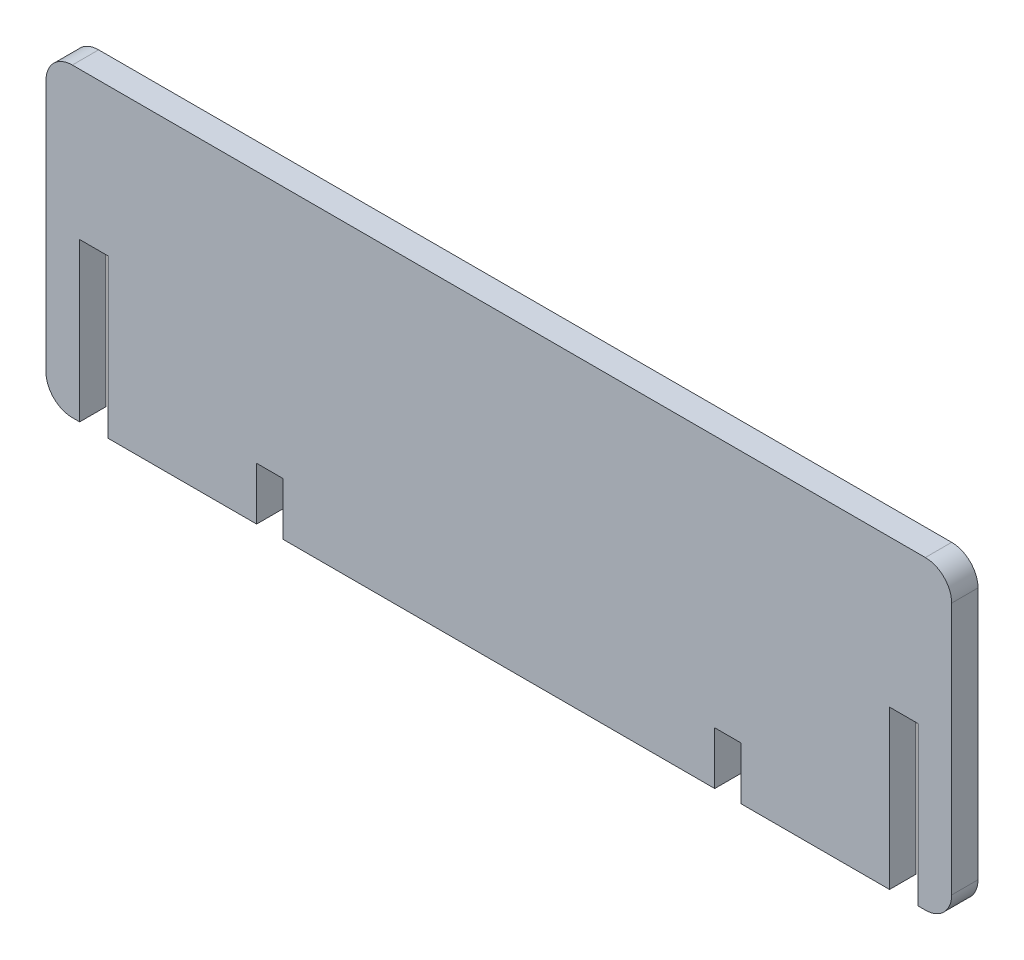
ISO-10303-21;
HEADER;
FILE_DESCRIPTION(('STEP AP214'),'2;1');
FILE_NAME('part.step','',(''),(''),'','','');
FILE_SCHEMA(('AUTOMOTIVE_DESIGN { 1 0 10303 214 1 1 1 1 }'));
ENDSEC;
DATA;
#1=APPLICATION_CONTEXT('core data for automotive mechanical design processes');
#2=APPLICATION_PROTOCOL_DEFINITION('international standard','automotive_design',2000,#1);
#3=PRODUCT_CONTEXT('',#1,'mechanical');
#4=PRODUCT('Part','Part','',(#3));
#5=PRODUCT_RELATED_PRODUCT_CATEGORY('part','',(#4));
#6=PRODUCT_DEFINITION_FORMATION('','',#4);
#7=PRODUCT_DEFINITION_CONTEXT('part definition',#1,'design');
#8=PRODUCT_DEFINITION('design','',#6,#7);
#9=PRODUCT_DEFINITION_SHAPE('','',#8);
#10=(LENGTH_UNIT() NAMED_UNIT(*) SI_UNIT(.MILLI.,.METRE.));
#11=(NAMED_UNIT(*) PLANE_ANGLE_UNIT() SI_UNIT($,.RADIAN.));
#12=(NAMED_UNIT(*) SI_UNIT($,.STERADIAN.) SOLID_ANGLE_UNIT());
#13=UNCERTAINTY_MEASURE_WITH_UNIT(LENGTH_MEASURE(1.E-05),#10,'distance_accuracy_value','');
#14=(GEOMETRIC_REPRESENTATION_CONTEXT(3) GLOBAL_UNCERTAINTY_ASSIGNED_CONTEXT((#13)) GLOBAL_UNIT_ASSIGNED_CONTEXT((#10,
#11,#12)) REPRESENTATION_CONTEXT('',''));
#15=CARTESIAN_POINT('',(0.,0.,0.));
#16=DIRECTION('',(0.,0.,1.));
#17=DIRECTION('',(1.,0.,0.));
#18=AXIS2_PLACEMENT_3D('',#15,#16,#17);
#19=CARTESIAN_POINT('',(-30.1312319017657,0.,2.5));
#20=DIRECTION('',(1.,0.,0.));
#21=DIRECTION('',(0.,1.,0.));
#22=AXIS2_PLACEMENT_3D('',#19,#20,#21);
#23=PLANE('',#22);
#24=DIRECTION('',(0.,-1.,0.));
#25=VECTOR('',#24,1.);
#26=CARTESIAN_POINT('',(-30.1312319017657,0.,0.));
#27=LINE('',#26,#25);
#28=CARTESIAN_POINT('',(-30.1312319017657,-74.9054673591406,0.));
#29=VERTEX_POINT('',#28);
#30=CARTESIAN_POINT('',(-30.1312319017657,-98.9054673591406,0.));
#31=VERTEX_POINT('',#30);
#32=EDGE_CURVE('E226',#29,#31,#27,.T.);
#33=ORIENTED_EDGE('',*,*,#32,.T.);
#34=DIRECTION('',(0.,0.,-1.));
#35=VECTOR('',#34,1.);
#36=CARTESIAN_POINT('',(-30.1312319017657,-98.9054673591406,2.5));
#37=LINE('',#36,#35);
#38=CARTESIAN_POINT('',(-30.1312319017657,-98.9054673591406,2.5));
#39=VERTEX_POINT('',#38);
#40=EDGE_CURVE('E11',#39,#31,#37,.T.);
#41=ORIENTED_EDGE('',*,*,#40,.F.);
#42=DIRECTION('',(0.,-1.,0.));
#43=VECTOR('',#42,1.);
#44=CARTESIAN_POINT('',(-30.1312319017657,0.,2.5));
#45=LINE('',#44,#43);
#46=CARTESIAN_POINT('',(-30.1312319017657,-74.9054673591406,2.5));
#47=VERTEX_POINT('',#46);
#48=EDGE_CURVE('E279',#47,#39,#45,.T.);
#49=ORIENTED_EDGE('',*,*,#48,.F.);
#50=DIRECTION('',(0.,0.,-1.));
#51=VECTOR('',#50,1.);
#52=CARTESIAN_POINT('',(-30.1312319017657,-74.9054673591406,2.5));
#53=LINE('',#52,#51);
#54=EDGE_CURVE('E222',#47,#29,#53,.T.);
#55=ORIENTED_EDGE('',*,*,#54,.T.);
#56=EDGE_LOOP('',(#33,#41,#49,#55));
#57=FACE_BOUND('',#56,.T.);
#58=ADVANCED_FACE('F36',(#57),#23,.F.);
#59=CARTESIAN_POINT('',(-27.6312319017657,-98.9054673591406,2.5));
#60=DIRECTION('',(0.,0.,-1.));
#61=DIRECTION('',(-1.,0.,0.));
#62=AXIS2_PLACEMENT_3D('',#59,#60,#61);
#63=CYLINDRICAL_SURFACE('',#62,2.49999999999999);
#64=CARTESIAN_POINT('',(-27.6312319017657,-98.9054673591406,0.));
#65=DIRECTION('',(0.,0.,1.));
#66=DIRECTION('',(1.,0.,0.));
#67=AXIS2_PLACEMENT_3D('',#64,#65,#66);
#68=CIRCLE('',#67,2.49999999999999);
#69=CARTESIAN_POINT('',(-27.6312319017657,-101.405467359141,0.));
#70=VERTEX_POINT('',#69);
#71=EDGE_CURVE('E229',#31,#70,#68,.T.);
#72=ORIENTED_EDGE('',*,*,#71,.T.);
#73=DIRECTION('',(0.,0.,-1.));
#74=VECTOR('',#73,1.);
#75=CARTESIAN_POINT('',(-27.6312319017657,-101.405467359141,2.5));
#76=LINE('',#75,#74);
#77=CARTESIAN_POINT('',(-27.6312319017657,-101.405467359141,2.5));
#78=VERTEX_POINT('',#77);
#79=EDGE_CURVE('E44',#78,#70,#76,.T.);
#80=ORIENTED_EDGE('',*,*,#79,.F.);
#81=CARTESIAN_POINT('',(-27.6312319017657,-98.9054673591406,2.5));
#82=DIRECTION('',(0.,0.,1.));
#83=DIRECTION('',(1.,0.,0.));
#84=AXIS2_PLACEMENT_3D('',#81,#82,#83);
#85=CIRCLE('',#84,2.49999999999999);
#86=EDGE_CURVE('E139',#39,#78,#85,.T.);
#87=ORIENTED_EDGE('',*,*,#86,.F.);
#88=ORIENTED_EDGE('',*,*,#40,.T.);
#89=EDGE_LOOP('',(#72,#80,#87,#88));
#90=FACE_BOUND('',#89,.T.);
#91=ADVANCED_FACE('F399',(#90),#63,.T.);
#92=CARTESIAN_POINT('',(0.,-101.405467359141,2.5));
#93=DIRECTION('',(0.,1.,0.));
#94=DIRECTION('',(-1.,0.,0.));
#95=AXIS2_PLACEMENT_3D('',#92,#93,#94);
#96=PLANE('',#95);
#97=DIRECTION('',(1.,0.,0.));
#98=VECTOR('',#97,1.);
#99=CARTESIAN_POINT('',(0.,-101.405467359141,0.));
#100=LINE('',#99,#98);
#101=CARTESIAN_POINT('',(-26.9342804178289,-101.405467359141,0.));
#102=VERTEX_POINT('',#101);
#103=EDGE_CURVE('E231',#70,#102,#100,.T.);
#104=ORIENTED_EDGE('',*,*,#103,.T.);
#105=DIRECTION('',(0.,0.,-1.));
#106=VECTOR('',#105,1.);
#107=CARTESIAN_POINT('',(-26.9342804178289,-101.405467359141,2.5));
#108=LINE('',#107,#106);
#109=CARTESIAN_POINT('',(-26.9342804178289,-101.405467359141,2.5));
#110=VERTEX_POINT('',#109);
#111=EDGE_CURVE('E326',#110,#102,#108,.T.);
#112=ORIENTED_EDGE('',*,*,#111,.F.);
#113=DIRECTION('',(1.,0.,0.));
#114=VECTOR('',#113,1.);
#115=CARTESIAN_POINT('',(0.,-101.405467359141,2.5));
#116=LINE('',#115,#114);
#117=EDGE_CURVE('E333',#78,#110,#116,.T.);
#118=ORIENTED_EDGE('',*,*,#117,.F.);
#119=ORIENTED_EDGE('',*,*,#79,.T.);
#120=EDGE_LOOP('',(#104,#112,#118,#119));
#121=FACE_BOUND('',#120,.T.);
#122=ADVANCED_FACE('F331',(#121),#96,.F.);
#123=CARTESIAN_POINT('',(-26.9342804178289,0.,2.5));
#124=DIRECTION('',(1.,0.,0.));
#125=DIRECTION('',(0.,1.,0.));
#126=AXIS2_PLACEMENT_3D('',#123,#124,#125);
#127=PLANE('',#126);
#128=DIRECTION('',(0.,-1.,0.));
#129=VECTOR('',#128,1.);
#130=CARTESIAN_POINT('',(-26.9342804178289,0.,0.));
#131=LINE('',#130,#129);
#132=CARTESIAN_POINT('',(-26.9342804178289,-86.4054673591406,0.));
#133=VERTEX_POINT('',#132);
#134=EDGE_CURVE('E234',#133,#102,#131,.T.);
#135=ORIENTED_EDGE('',*,*,#134,.F.);
#136=DIRECTION('',(0.,0.,-1.));
#137=VECTOR('',#136,1.);
#138=CARTESIAN_POINT('',(-26.9342804178289,-86.4054673591406,2.5));
#139=LINE('',#138,#137);
#140=CARTESIAN_POINT('',(-26.9342804178289,-86.4054673591406,2.5));
#141=VERTEX_POINT('',#140);
#142=EDGE_CURVE('E324',#141,#133,#139,.T.);
#143=ORIENTED_EDGE('',*,*,#142,.F.);
#144=DIRECTION('',(0.,-1.,0.));
#145=VECTOR('',#144,1.);
#146=CARTESIAN_POINT('',(-26.9342804178289,0.,2.5));
#147=LINE('',#146,#145);
#148=EDGE_CURVE('E345',#141,#110,#147,.T.);
#149=ORIENTED_EDGE('',*,*,#148,.T.);
#150=ORIENTED_EDGE('',*,*,#111,.T.);
#151=EDGE_LOOP('',(#135,#143,#149,#150));
#152=FACE_BOUND('',#151,.T.);
#153=ADVANCED_FACE('F341',(#152),#127,.T.);
#154=CARTESIAN_POINT('',(0.,-86.4054673591406,2.5));
#155=DIRECTION('',(0.,1.,0.));
#156=DIRECTION('',(0.,0.,1.));
#157=AXIS2_PLACEMENT_3D('',#154,#155,#156);
#158=PLANE('',#157);
#159=DIRECTION('',(1.,0.,0.));
#160=VECTOR('',#159,1.);
#161=CARTESIAN_POINT('',(0.,-86.4054673591406,0.));
#162=LINE('',#161,#160);
#163=CARTESIAN_POINT('',(-24.2312319017657,-86.4054673591406,0.));
#164=VERTEX_POINT('',#163);
#165=EDGE_CURVE('E239',#133,#164,#162,.T.);
#166=ORIENTED_EDGE('',*,*,#165,.T.);
#167=DIRECTION('',(0.,0.,-1.));
#168=VECTOR('',#167,1.);
#169=CARTESIAN_POINT('',(-24.2312319017657,-86.4054673591406,2.5));
#170=LINE('',#169,#168);
#171=CARTESIAN_POINT('',(-24.2312319017657,-86.4054673591406,2.5));
#172=VERTEX_POINT('',#171);
#173=EDGE_CURVE('E321',#172,#164,#170,.T.);
#174=ORIENTED_EDGE('',*,*,#173,.F.);
#175=DIRECTION('',(1.,0.,0.));
#176=VECTOR('',#175,1.);
#177=CARTESIAN_POINT('',(0.,-86.4054673591406,2.5));
#178=LINE('',#177,#176);
#179=EDGE_CURVE('E346',#141,#172,#178,.T.);
#180=ORIENTED_EDGE('',*,*,#179,.F.);
#181=ORIENTED_EDGE('',*,*,#142,.T.);
#182=EDGE_LOOP('',(#166,#174,#180,#181));
#183=FACE_BOUND('',#182,.T.);
#184=ADVANCED_FACE('F412',(#183),#158,.F.);
#185=CARTESIAN_POINT('',(-24.2312319017657,0.,2.5));
#186=DIRECTION('',(1.,0.,0.));
#187=DIRECTION('',(0.,0.,-1.));
#188=AXIS2_PLACEMENT_3D('',#185,#186,#187);
#189=PLANE('',#188);
#190=DIRECTION('',(0.,-1.,0.));
#191=VECTOR('',#190,1.);
#192=CARTESIAN_POINT('',(-24.2312319017657,0.,0.));
#193=LINE('',#192,#191);
#194=CARTESIAN_POINT('',(-24.2312319017657,-101.405467359141,0.));
#195=VERTEX_POINT('',#194);
#196=EDGE_CURVE('E241',#164,#195,#193,.T.);
#197=ORIENTED_EDGE('',*,*,#196,.T.);
#198=DIRECTION('',(0.,0.,-1.));
#199=VECTOR('',#198,1.);
#200=CARTESIAN_POINT('',(-24.2312319017657,-101.405467359141,2.5));
#201=LINE('',#200,#199);
#202=CARTESIAN_POINT('',(-24.2312319017657,-101.405467359141,2.5));
#203=VERTEX_POINT('',#202);
#204=EDGE_CURVE('E318',#203,#195,#201,.T.);
#205=ORIENTED_EDGE('',*,*,#204,.F.);
#206=DIRECTION('',(0.,-1.,0.));
#207=VECTOR('',#206,1.);
#208=CARTESIAN_POINT('',(-24.2312319017657,0.,2.5));
#209=LINE('',#208,#207);
#210=EDGE_CURVE('E348',#172,#203,#209,.T.);
#211=ORIENTED_EDGE('',*,*,#210,.F.);
#212=ORIENTED_EDGE('',*,*,#173,.T.);
#213=EDGE_LOOP('',(#197,#205,#211,#212));
#214=FACE_BOUND('',#213,.T.);
#215=ADVANCED_FACE('F415',(#214),#189,.F.);
#216=CARTESIAN_POINT('',(-10.1312319017657,-101.405467359141,0.));
#217=VERTEX_POINT('',#216);
#218=EDGE_CURVE('E236',#195,#217,#100,.T.);
#219=ORIENTED_EDGE('',*,*,#218,.T.);
#220=DIRECTION('',(0.,0.,-1.));
#221=VECTOR('',#220,1.);
#222=CARTESIAN_POINT('',(-10.1312319017657,-101.405467359141,2.5));
#223=LINE('',#222,#221);
#224=CARTESIAN_POINT('',(-10.1312319017657,-101.405467359141,2.5));
#225=VERTEX_POINT('',#224);
#226=EDGE_CURVE('E315',#225,#217,#223,.T.);
#227=ORIENTED_EDGE('',*,*,#226,.F.);
#228=EDGE_CURVE('E352',#203,#225,#116,.T.);
#229=ORIENTED_EDGE('',*,*,#228,.F.);
#230=ORIENTED_EDGE('',*,*,#204,.T.);
#231=EDGE_LOOP('',(#219,#227,#229,#230));
#232=FACE_BOUND('',#231,.T.);
#233=ADVANCED_FACE('F407',(#232),#96,.F.);
#234=CARTESIAN_POINT('',(-10.1312319017657,0.,2.5));
#235=DIRECTION('',(-1.,0.,0.));
#236=DIRECTION('',(0.,0.,1.));
#237=AXIS2_PLACEMENT_3D('',#234,#235,#236);
#238=PLANE('',#237);
#239=DIRECTION('',(0.,1.,0.));
#240=VECTOR('',#239,1.);
#241=CARTESIAN_POINT('',(-10.1312319017657,0.,0.));
#242=LINE('',#241,#240);
#243=CARTESIAN_POINT('',(-10.1312319017657,-96.4054673591407,0.));
#244=VERTEX_POINT('',#243);
#245=EDGE_CURVE('E243',#217,#244,#242,.T.);
#246=ORIENTED_EDGE('',*,*,#245,.T.);
#247=DIRECTION('',(0.,0.,-1.));
#248=VECTOR('',#247,1.);
#249=CARTESIAN_POINT('',(-10.1312319017657,-96.4054673591407,2.5));
#250=LINE('',#249,#248);
#251=CARTESIAN_POINT('',(-10.1312319017657,-96.4054673591407,2.5));
#252=VERTEX_POINT('',#251);
#253=EDGE_CURVE('E312',#252,#244,#250,.T.);
#254=ORIENTED_EDGE('',*,*,#253,.F.);
#255=DIRECTION('',(0.,1.,0.));
#256=VECTOR('',#255,1.);
#257=CARTESIAN_POINT('',(-10.1312319017657,0.,2.5));
#258=LINE('',#257,#256);
#259=EDGE_CURVE('E356',#225,#252,#258,.T.);
#260=ORIENTED_EDGE('',*,*,#259,.F.);
#261=ORIENTED_EDGE('',*,*,#226,.T.);
#262=EDGE_LOOP('',(#246,#254,#260,#261));
#263=FACE_BOUND('',#262,.T.);
#264=ADVANCED_FACE('F420',(#263),#238,.F.);
#265=CARTESIAN_POINT('',(0.,-96.4054673591407,2.5));
#266=DIRECTION('',(0.,1.,0.));
#267=DIRECTION('',(0.,0.,1.));
#268=AXIS2_PLACEMENT_3D('',#265,#266,#267);
#269=PLANE('',#268);
#270=DIRECTION('',(1.,0.,0.));
#271=VECTOR('',#270,1.);
#272=CARTESIAN_POINT('',(0.,-96.4054673591407,0.));
#273=LINE('',#272,#271);
#274=CARTESIAN_POINT('',(-7.63123190176568,-96.4054673591407,0.));
#275=VERTEX_POINT('',#274);
#276=EDGE_CURVE('E245',#244,#275,#273,.T.);
#277=ORIENTED_EDGE('',*,*,#276,.T.);
#278=DIRECTION('',(0.,0.,-1.));
#279=VECTOR('',#278,1.);
#280=CARTESIAN_POINT('',(-7.63123190176568,-96.4054673591407,2.5));
#281=LINE('',#280,#279);
#282=CARTESIAN_POINT('',(-7.63123190176568,-96.4054673591407,2.5));
#283=VERTEX_POINT('',#282);
#284=EDGE_CURVE('E310',#283,#275,#281,.T.);
#285=ORIENTED_EDGE('',*,*,#284,.F.);
#286=DIRECTION('',(1.,0.,0.));
#287=VECTOR('',#286,1.);
#288=CARTESIAN_POINT('',(0.,-96.4054673591407,2.5));
#289=LINE('',#288,#287);
#290=EDGE_CURVE('E358',#252,#283,#289,.T.);
#291=ORIENTED_EDGE('',*,*,#290,.F.);
#292=ORIENTED_EDGE('',*,*,#253,.T.);
#293=EDGE_LOOP('',(#277,#285,#291,#292));
#294=FACE_BOUND('',#293,.T.);
#295=ADVANCED_FACE('F423',(#294),#269,.F.);
#296=CARTESIAN_POINT('',(-7.63123190176568,0.,2.5));
#297=DIRECTION('',(-1.,0.,0.));
#298=DIRECTION('',(0.,0.,1.));
#299=AXIS2_PLACEMENT_3D('',#296,#297,#298);
#300=PLANE('',#299);
#301=DIRECTION('',(0.,1.,0.));
#302=VECTOR('',#301,1.);
#303=CARTESIAN_POINT('',(-7.63123190176568,0.,0.));
#304=LINE('',#303,#302);
#305=CARTESIAN_POINT('',(-7.63123190176568,-101.405467359141,0.));
#306=VERTEX_POINT('',#305);
#307=EDGE_CURVE('E248',#306,#275,#304,.T.);
#308=ORIENTED_EDGE('',*,*,#307,.F.);
#309=DIRECTION('',(0.,0.,-1.));
#310=VECTOR('',#309,1.);
#311=CARTESIAN_POINT('',(-7.63123190176568,-101.405467359141,2.5));
#312=LINE('',#311,#310);
#313=CARTESIAN_POINT('',(-7.63123190176568,-101.405467359141,2.5));
#314=VERTEX_POINT('',#313);
#315=EDGE_CURVE('E308',#314,#306,#312,.T.);
#316=ORIENTED_EDGE('',*,*,#315,.F.);
#317=DIRECTION('',(0.,1.,0.));
#318=VECTOR('',#317,1.);
#319=CARTESIAN_POINT('',(-7.63123190176568,0.,2.5));
#320=LINE('',#319,#318);
#321=EDGE_CURVE('E360',#314,#283,#320,.T.);
#322=ORIENTED_EDGE('',*,*,#321,.T.);
#323=ORIENTED_EDGE('',*,*,#284,.T.);
#324=EDGE_LOOP('',(#308,#316,#322,#323));
#325=FACE_BOUND('',#324,.T.);
#326=ADVANCED_FACE('F427',(#325),#300,.T.);
#327=CARTESIAN_POINT('',(33.3687680982343,-101.405467359141,0.));
#328=VERTEX_POINT('',#327);
#329=EDGE_CURVE('E251',#306,#328,#100,.T.);
#330=ORIENTED_EDGE('',*,*,#329,.T.);
#331=DIRECTION('',(0.,0.,-1.));
#332=VECTOR('',#331,1.);
#333=CARTESIAN_POINT('',(33.3687680982343,-101.405467359141,2.5));
#334=LINE('',#333,#332);
#335=CARTESIAN_POINT('',(33.3687680982343,-101.405467359141,2.5));
#336=VERTEX_POINT('',#335);
#337=EDGE_CURVE('E305',#336,#328,#334,.T.);
#338=ORIENTED_EDGE('',*,*,#337,.F.);
#339=EDGE_CURVE('E363',#314,#336,#116,.T.);
#340=ORIENTED_EDGE('',*,*,#339,.F.);
#341=ORIENTED_EDGE('',*,*,#315,.T.);
#342=EDGE_LOOP('',(#330,#338,#340,#341));
#343=FACE_BOUND('',#342,.T.);
#344=ADVANCED_FACE('F431',(#343),#96,.F.);
#345=CARTESIAN_POINT('',(33.3687680982343,0.,2.5));
#346=DIRECTION('',(-1.,0.,0.));
#347=DIRECTION('',(0.,0.,1.));
#348=AXIS2_PLACEMENT_3D('',#345,#346,#347);
#349=PLANE('',#348);
#350=DIRECTION('',(0.,1.,0.));
#351=VECTOR('',#350,1.);
#352=CARTESIAN_POINT('',(33.3687680982343,0.,0.));
#353=LINE('',#352,#351);
#354=CARTESIAN_POINT('',(33.3687680982343,-96.4054673591406,0.));
#355=VERTEX_POINT('',#354);
#356=EDGE_CURVE('E252',#328,#355,#353,.T.);
#357=ORIENTED_EDGE('',*,*,#356,.T.);
#358=DIRECTION('',(0.,0.,-1.));
#359=VECTOR('',#358,1.);
#360=CARTESIAN_POINT('',(33.3687680982343,-96.4054673591406,2.5));
#361=LINE('',#360,#359);
#362=CARTESIAN_POINT('',(33.3687680982343,-96.4054673591406,2.5));
#363=VERTEX_POINT('',#362);
#364=EDGE_CURVE('E302',#363,#355,#361,.T.);
#365=ORIENTED_EDGE('',*,*,#364,.F.);
#366=DIRECTION('',(0.,1.,0.));
#367=VECTOR('',#366,1.);
#368=CARTESIAN_POINT('',(33.3687680982343,0.,2.5));
#369=LINE('',#368,#367);
#370=EDGE_CURVE('E364',#336,#363,#369,.T.);
#371=ORIENTED_EDGE('',*,*,#370,.F.);
#372=ORIENTED_EDGE('',*,*,#337,.T.);
#373=EDGE_LOOP('',(#357,#365,#371,#372));
#374=FACE_BOUND('',#373,.T.);
#375=ADVANCED_FACE('F433',(#374),#349,.F.);
#376=CARTESIAN_POINT('',(0.,-96.4054673591406,2.5));
#377=DIRECTION('',(0.,1.,0.));
#378=DIRECTION('',(0.,0.,1.));
#379=AXIS2_PLACEMENT_3D('',#376,#377,#378);
#380=PLANE('',#379);
#381=DIRECTION('',(1.,0.,0.));
#382=VECTOR('',#381,1.);
#383=CARTESIAN_POINT('',(0.,-96.4054673591406,0.));
#384=LINE('',#383,#382);
#385=CARTESIAN_POINT('',(35.8687680982343,-96.4054673591406,0.));
#386=VERTEX_POINT('',#385);
#387=EDGE_CURVE('E254',#355,#386,#384,.T.);
#388=ORIENTED_EDGE('',*,*,#387,.T.);
#389=DIRECTION('',(0.,0.,-1.));
#390=VECTOR('',#389,1.);
#391=CARTESIAN_POINT('',(35.8687680982343,-96.4054673591406,2.5));
#392=LINE('',#391,#390);
#393=CARTESIAN_POINT('',(35.8687680982343,-96.4054673591406,2.5));
#394=VERTEX_POINT('',#393);
#395=EDGE_CURVE('E300',#394,#386,#392,.T.);
#396=ORIENTED_EDGE('',*,*,#395,.F.);
#397=DIRECTION('',(1.,0.,0.));
#398=VECTOR('',#397,1.);
#399=CARTESIAN_POINT('',(0.,-96.4054673591406,2.5));
#400=LINE('',#399,#398);
#401=EDGE_CURVE('E366',#363,#394,#400,.T.);
#402=ORIENTED_EDGE('',*,*,#401,.F.);
#403=ORIENTED_EDGE('',*,*,#364,.T.);
#404=EDGE_LOOP('',(#388,#396,#402,#403));
#405=FACE_BOUND('',#404,.T.);
#406=ADVANCED_FACE('F436',(#405),#380,.F.);
#407=CARTESIAN_POINT('',(35.8687680982343,0.,2.5));
#408=DIRECTION('',(-1.,0.,0.));
#409=DIRECTION('',(0.,0.,1.));
#410=AXIS2_PLACEMENT_3D('',#407,#408,#409);
#411=PLANE('',#410);
#412=DIRECTION('',(0.,1.,0.));
#413=VECTOR('',#412,1.);
#414=CARTESIAN_POINT('',(35.8687680982343,0.,0.));
#415=LINE('',#414,#413);
#416=CARTESIAN_POINT('',(35.8687680982343,-101.405467359141,0.));
#417=VERTEX_POINT('',#416);
#418=EDGE_CURVE('E257',#417,#386,#415,.T.);
#419=ORIENTED_EDGE('',*,*,#418,.F.);
#420=DIRECTION('',(0.,0.,-1.));
#421=VECTOR('',#420,1.);
#422=CARTESIAN_POINT('',(35.8687680982343,-101.405467359141,2.5));
#423=LINE('',#422,#421);
#424=CARTESIAN_POINT('',(35.8687680982343,-101.405467359141,2.5));
#425=VERTEX_POINT('',#424);
#426=EDGE_CURVE('E298',#425,#417,#423,.T.);
#427=ORIENTED_EDGE('',*,*,#426,.F.);
#428=DIRECTION('',(0.,1.,0.));
#429=VECTOR('',#428,1.);
#430=CARTESIAN_POINT('',(35.8687680982343,0.,2.5));
#431=LINE('',#430,#429);
#432=EDGE_CURVE('E368',#425,#394,#431,.T.);
#433=ORIENTED_EDGE('',*,*,#432,.T.);
#434=ORIENTED_EDGE('',*,*,#395,.T.);
#435=EDGE_LOOP('',(#419,#427,#433,#434));
#436=FACE_BOUND('',#435,.T.);
#437=ADVANCED_FACE('F440',(#436),#411,.T.);
#438=CARTESIAN_POINT('',(49.9687680982343,-101.405467359141,0.));
#439=VERTEX_POINT('',#438);
#440=EDGE_CURVE('E260',#417,#439,#100,.T.);
#441=ORIENTED_EDGE('',*,*,#440,.T.);
#442=DIRECTION('',(0.,0.,-1.));
#443=VECTOR('',#442,1.);
#444=CARTESIAN_POINT('',(49.9687680982343,-101.405467359141,2.5));
#445=LINE('',#444,#443);
#446=CARTESIAN_POINT('',(49.9687680982343,-101.405467359141,2.5));
#447=VERTEX_POINT('',#446);
#448=EDGE_CURVE('E295',#447,#439,#445,.T.);
#449=ORIENTED_EDGE('',*,*,#448,.F.);
#450=EDGE_CURVE('E371',#425,#447,#116,.T.);
#451=ORIENTED_EDGE('',*,*,#450,.F.);
#452=ORIENTED_EDGE('',*,*,#426,.T.);
#453=EDGE_LOOP('',(#441,#449,#451,#452));
#454=FACE_BOUND('',#453,.T.);
#455=ADVANCED_FACE('F444',(#454),#96,.F.);
#456=CARTESIAN_POINT('',(49.9687680982343,0.,2.5));
#457=DIRECTION('',(-1.,0.,0.));
#458=DIRECTION('',(0.,-1.,0.));
#459=AXIS2_PLACEMENT_3D('',#456,#457,#458);
#460=PLANE('',#459);
#461=DIRECTION('',(0.,1.,0.));
#462=VECTOR('',#461,1.);
#463=CARTESIAN_POINT('',(49.9687680982343,0.,0.));
#464=LINE('',#463,#462);
#465=CARTESIAN_POINT('',(49.9687680982343,-86.4054673591406,0.));
#466=VERTEX_POINT('',#465);
#467=EDGE_CURVE('E261',#439,#466,#464,.T.);
#468=ORIENTED_EDGE('',*,*,#467,.T.);
#469=DIRECTION('',(0.,0.,-1.));
#470=VECTOR('',#469,1.);
#471=CARTESIAN_POINT('',(49.9687680982343,-86.4054673591406,2.5));
#472=LINE('',#471,#470);
#473=CARTESIAN_POINT('',(49.9687680982343,-86.4054673591406,2.5));
#474=VERTEX_POINT('',#473);
#475=EDGE_CURVE('E292',#474,#466,#472,.T.);
#476=ORIENTED_EDGE('',*,*,#475,.F.);
#477=DIRECTION('',(0.,1.,0.));
#478=VECTOR('',#477,1.);
#479=CARTESIAN_POINT('',(49.9687680982343,0.,2.5));
#480=LINE('',#479,#478);
#481=EDGE_CURVE('E372',#447,#474,#480,.T.);
#482=ORIENTED_EDGE('',*,*,#481,.F.);
#483=ORIENTED_EDGE('',*,*,#448,.T.);
#484=EDGE_LOOP('',(#468,#476,#482,#483));
#485=FACE_BOUND('',#484,.T.);
#486=ADVANCED_FACE('F446',(#485),#460,.F.);
#487=CARTESIAN_POINT('',(4.43616433193588E-13,-86.4054673591409,2.5));
#488=DIRECTION('',(0.,1.,0.));
#489=DIRECTION('',(-1.,0.,0.));
#490=AXIS2_PLACEMENT_3D('',#487,#488,#489);
#491=PLANE('',#490);
#492=DIRECTION('',(1.,0.,0.));
#493=VECTOR('',#492,1.);
#494=CARTESIAN_POINT('',(4.43616433193588E-13,-86.4054673591409,0.));
#495=LINE('',#494,#493);
#496=CARTESIAN_POINT('',(52.6718166142976,-86.4054673591406,0.));
#497=VERTEX_POINT('',#496);
#498=EDGE_CURVE('E263',#466,#497,#495,.T.);
#499=ORIENTED_EDGE('',*,*,#498,.T.);
#500=DIRECTION('',(0.,0.,-1.));
#501=VECTOR('',#500,1.);
#502=CARTESIAN_POINT('',(52.6718166142976,-86.4054673591406,2.5));
#503=LINE('',#502,#501);
#504=CARTESIAN_POINT('',(52.6718166142976,-86.4054673591406,2.5));
#505=VERTEX_POINT('',#504);
#506=EDGE_CURVE('E290',#505,#497,#503,.T.);
#507=ORIENTED_EDGE('',*,*,#506,.F.);
#508=DIRECTION('',(1.,0.,0.));
#509=VECTOR('',#508,1.);
#510=CARTESIAN_POINT('',(4.43616433193588E-13,-86.4054673591409,2.5));
#511=LINE('',#510,#509);
#512=EDGE_CURVE('E374',#474,#505,#511,.T.);
#513=ORIENTED_EDGE('',*,*,#512,.F.);
#514=ORIENTED_EDGE('',*,*,#475,.T.);
#515=EDGE_LOOP('',(#499,#507,#513,#514));
#516=FACE_BOUND('',#515,.T.);
#517=ADVANCED_FACE('F449',(#516),#491,.F.);
#518=CARTESIAN_POINT('',(52.6718166142976,0.,2.5));
#519=DIRECTION('',(-1.,0.,0.));
#520=DIRECTION('',(0.,0.,1.));
#521=AXIS2_PLACEMENT_3D('',#518,#519,#520);
#522=PLANE('',#521);
#523=DIRECTION('',(0.,1.,0.));
#524=VECTOR('',#523,1.);
#525=CARTESIAN_POINT('',(52.6718166142976,0.,0.));
#526=LINE('',#525,#524);
#527=CARTESIAN_POINT('',(52.6718166142976,-101.405467359141,0.));
#528=VERTEX_POINT('',#527);
#529=EDGE_CURVE('E266',#528,#497,#526,.T.);
#530=ORIENTED_EDGE('',*,*,#529,.F.);
#531=DIRECTION('',(0.,0.,-1.));
#532=VECTOR('',#531,1.);
#533=CARTESIAN_POINT('',(52.6718166142976,-101.405467359141,2.5));
#534=LINE('',#533,#532);
#535=CARTESIAN_POINT('',(52.6718166142976,-101.405467359141,2.5));
#536=VERTEX_POINT('',#535);
#537=EDGE_CURVE('E288',#536,#528,#534,.T.);
#538=ORIENTED_EDGE('',*,*,#537,.F.);
#539=DIRECTION('',(0.,1.,0.));
#540=VECTOR('',#539,1.);
#541=CARTESIAN_POINT('',(52.6718166142976,0.,2.5));
#542=LINE('',#541,#540);
#543=EDGE_CURVE('E376',#536,#505,#542,.T.);
#544=ORIENTED_EDGE('',*,*,#543,.T.);
#545=ORIENTED_EDGE('',*,*,#506,.T.);
#546=EDGE_LOOP('',(#530,#538,#544,#545));
#547=FACE_BOUND('',#546,.T.);
#548=ADVANCED_FACE('F453',(#547),#522,.T.);
#549=CARTESIAN_POINT('',(53.3687680982343,-101.405467359141,0.));
#550=VERTEX_POINT('',#549);
#551=EDGE_CURVE('E235',#528,#550,#100,.T.);
#552=ORIENTED_EDGE('',*,*,#551,.T.);
#553=DIRECTION('',(0.,0.,-1.));
#554=VECTOR('',#553,1.);
#555=CARTESIAN_POINT('',(53.3687680982343,-101.405467359141,2.5));
#556=LINE('',#555,#554);
#557=CARTESIAN_POINT('',(53.3687680982343,-101.405467359141,2.5));
#558=VERTEX_POINT('',#557);
#559=EDGE_CURVE('E285',#558,#550,#556,.T.);
#560=ORIENTED_EDGE('',*,*,#559,.F.);
#561=EDGE_CURVE('E351',#536,#558,#116,.T.);
#562=ORIENTED_EDGE('',*,*,#561,.F.);
#563=ORIENTED_EDGE('',*,*,#537,.T.);
#564=EDGE_LOOP('',(#552,#560,#562,#563));
#565=FACE_BOUND('',#564,.T.);
#566=ADVANCED_FACE('F408',(#565),#96,.F.);
#567=CARTESIAN_POINT('',(53.3687680982343,-98.9054673591406,2.5));
#568=DIRECTION('',(0.,0.,-1.));
#569=DIRECTION('',(-1.,0.,0.));
#570=AXIS2_PLACEMENT_3D('',#567,#568,#569);
#571=CYLINDRICAL_SURFACE('',#570,2.49999999999999);
#572=CARTESIAN_POINT('',(53.3687680982343,-98.9054673591406,0.));
#573=DIRECTION('',(0.,0.,1.));
#574=DIRECTION('',(1.,0.,0.));
#575=AXIS2_PLACEMENT_3D('',#572,#573,#574);
#576=CIRCLE('',#575,2.49999999999999);
#577=CARTESIAN_POINT('',(55.8687680982343,-98.9054673591406,0.));
#578=VERTEX_POINT('',#577);
#579=EDGE_CURVE('E269',#550,#578,#576,.T.);
#580=ORIENTED_EDGE('',*,*,#579,.T.);
#581=DIRECTION('',(0.,0.,-1.));
#582=VECTOR('',#581,1.);
#583=CARTESIAN_POINT('',(55.8687680982343,-98.9054673591406,2.5));
#584=LINE('',#583,#582);
#585=CARTESIAN_POINT('',(55.8687680982343,-98.9054673591406,2.5));
#586=VERTEX_POINT('',#585);
#587=EDGE_CURVE('E283',#586,#578,#584,.T.);
#588=ORIENTED_EDGE('',*,*,#587,.F.);
#589=CARTESIAN_POINT('',(53.3687680982343,-98.9054673591406,2.5));
#590=DIRECTION('',(0.,0.,1.));
#591=DIRECTION('',(1.,0.,0.));
#592=AXIS2_PLACEMENT_3D('',#589,#590,#591);
#593=CIRCLE('',#592,2.49999999999999);
#594=EDGE_CURVE('E379',#558,#586,#593,.T.);
#595=ORIENTED_EDGE('',*,*,#594,.F.);
#596=ORIENTED_EDGE('',*,*,#559,.T.);
#597=EDGE_LOOP('',(#580,#588,#595,#596));
#598=FACE_BOUND('',#597,.T.);
#599=ADVANCED_FACE('F459',(#598),#571,.T.);
#600=CARTESIAN_POINT('',(55.8687680982343,0.,2.5));
#601=DIRECTION('',(1.,0.,0.));
#602=DIRECTION('',(0.,0.,-1.));
#603=AXIS2_PLACEMENT_3D('',#600,#601,#602);
#604=PLANE('',#603);
#605=DIRECTION('',(0.,-1.,0.));
#606=VECTOR('',#605,1.);
#607=CARTESIAN_POINT('',(55.8687680982343,0.,0.));
#608=LINE('',#607,#606);
#609=CARTESIAN_POINT('',(55.8687680982343,-74.9054673591406,0.));
#610=VERTEX_POINT('',#609);
#611=EDGE_CURVE('E272',#610,#578,#608,.T.);
#612=ORIENTED_EDGE('',*,*,#611,.F.);
#613=DIRECTION('',(0.,0.,-1.));
#614=VECTOR('',#613,1.);
#615=CARTESIAN_POINT('',(55.8687680982343,-74.9054673591406,2.5));
#616=LINE('',#615,#614);
#617=CARTESIAN_POINT('',(55.8687680982343,-74.9054673591406,2.5));
#618=VERTEX_POINT('',#617);
#619=EDGE_CURVE('E212',#618,#610,#616,.T.);
#620=ORIENTED_EDGE('',*,*,#619,.F.);
#621=DIRECTION('',(0.,-1.,0.));
#622=VECTOR('',#621,1.);
#623=CARTESIAN_POINT('',(55.8687680982343,0.,2.5));
#624=LINE('',#623,#622);
#625=EDGE_CURVE('E218',#618,#586,#624,.T.);
#626=ORIENTED_EDGE('',*,*,#625,.T.);
#627=ORIENTED_EDGE('',*,*,#587,.T.);
#628=EDGE_LOOP('',(#612,#620,#626,#627));
#629=FACE_BOUND('',#628,.T.);
#630=ADVANCED_FACE('F382',(#629),#604,.T.);
#631=CARTESIAN_POINT('',(53.3687680982343,-74.9054673591406,2.5));
#632=DIRECTION('',(0.,0.,-1.));
#633=DIRECTION('',(-1.,0.,0.));
#634=AXIS2_PLACEMENT_3D('',#631,#632,#633);
#635=CYLINDRICAL_SURFACE('',#634,2.5);
#636=CARTESIAN_POINT('',(53.3687680982343,-74.9054673591406,0.));
#637=DIRECTION('',(0.,0.,1.));
#638=DIRECTION('',(1.,0.,0.));
#639=AXIS2_PLACEMENT_3D('',#636,#637,#638);
#640=CIRCLE('',#639,2.5);
#641=CARTESIAN_POINT('',(53.3687680982343,-72.4054673591406,0.));
#642=VERTEX_POINT('',#641);
#643=EDGE_CURVE('E207',#642,#610,#640,.F.);
#644=ORIENTED_EDGE('',*,*,#643,.F.);
#645=DIRECTION('',(0.,0.,-1.));
#646=VECTOR('',#645,1.);
#647=CARTESIAN_POINT('',(53.3687680982343,-72.4054673591406,2.5));
#648=LINE('',#647,#646);
#649=CARTESIAN_POINT('',(53.3687680982343,-72.4054673591406,2.5));
#650=VERTEX_POINT('',#649);
#651=EDGE_CURVE('E202',#650,#642,#648,.T.);
#652=ORIENTED_EDGE('',*,*,#651,.F.);
#653=CARTESIAN_POINT('',(53.3687680982343,-74.9054673591406,2.5));
#654=DIRECTION('',(0.,0.,1.));
#655=DIRECTION('',(1.,0.,0.));
#656=AXIS2_PLACEMENT_3D('',#653,#654,#655);
#657=CIRCLE('',#656,2.5);
#658=EDGE_CURVE('E205',#650,#618,#657,.F.);
#659=ORIENTED_EDGE('',*,*,#658,.T.);
#660=ORIENTED_EDGE('',*,*,#619,.T.);
#661=EDGE_LOOP('',(#644,#652,#659,#660));
#662=FACE_BOUND('',#661,.T.);
#663=ADVANCED_FACE('F204',(#662),#635,.T.);
#664=CARTESIAN_POINT('',(0.,-72.4054673591406,2.5));
#665=DIRECTION('',(0.,1.,0.));
#666=DIRECTION('',(-1.,0.,0.));
#667=AXIS2_PLACEMENT_3D('',#664,#665,#666);
#668=PLANE('',#667);
#669=DIRECTION('',(1.,0.,0.));
#670=VECTOR('',#669,1.);
#671=CARTESIAN_POINT('',(0.,-72.4054673591406,0.));
#672=LINE('',#671,#670);
#673=CARTESIAN_POINT('',(-27.6312319017657,-72.4054673591406,0.));
#674=VERTEX_POINT('',#673);
#675=EDGE_CURVE('E276',#674,#642,#672,.T.);
#676=ORIENTED_EDGE('',*,*,#675,.F.);
#677=DIRECTION('',(0.,0.,-1.));
#678=VECTOR('',#677,1.);
#679=CARTESIAN_POINT('',(-27.6312319017657,-72.4054673591406,2.5));
#680=LINE('',#679,#678);
#681=CARTESIAN_POINT('',(-27.6312319017657,-72.4054673591406,2.5));
#682=VERTEX_POINT('',#681);
#683=EDGE_CURVE('E128',#682,#674,#680,.T.);
#684=ORIENTED_EDGE('',*,*,#683,.F.);
#685=DIRECTION('',(1.,0.,0.));
#686=VECTOR('',#685,1.);
#687=CARTESIAN_POINT('',(0.,-72.4054673591406,2.5));
#688=LINE('',#687,#686);
#689=EDGE_CURVE('E216',#682,#650,#688,.T.);
#690=ORIENTED_EDGE('',*,*,#689,.T.);
#691=ORIENTED_EDGE('',*,*,#651,.T.);
#692=EDGE_LOOP('',(#676,#684,#690,#691));
#693=FACE_BOUND('',#692,.T.);
#694=ADVANCED_FACE('F220',(#693),#668,.T.);
#695=CARTESIAN_POINT('',(-27.6312319017657,-74.9054673591406,2.5));
#696=DIRECTION('',(0.,0.,-1.));
#697=DIRECTION('',(-1.,0.,0.));
#698=AXIS2_PLACEMENT_3D('',#695,#696,#697);
#699=CYLINDRICAL_SURFACE('',#698,2.5);
#700=CARTESIAN_POINT('',(-27.6312319017657,-74.9054673591406,0.));
#701=DIRECTION('',(0.,0.,1.));
#702=DIRECTION('',(1.,0.,0.));
#703=AXIS2_PLACEMENT_3D('',#700,#701,#702);
#704=CIRCLE('',#703,2.5);
#705=EDGE_CURVE('E131',#674,#29,#704,.T.);
#706=ORIENTED_EDGE('',*,*,#705,.T.);
#707=ORIENTED_EDGE('',*,*,#54,.F.);
#708=CARTESIAN_POINT('',(-27.6312319017657,-74.9054673591406,2.5));
#709=DIRECTION('',(0.,0.,1.));
#710=DIRECTION('',(1.,0.,0.));
#711=AXIS2_PLACEMENT_3D('',#708,#709,#710);
#712=CIRCLE('',#711,2.5);
#713=EDGE_CURVE('E52',#682,#47,#712,.T.);
#714=ORIENTED_EDGE('',*,*,#713,.F.);
#715=ORIENTED_EDGE('',*,*,#683,.T.);
#716=EDGE_LOOP('',(#706,#707,#714,#715));
#717=FACE_BOUND('',#716,.T.);
#718=ADVANCED_FACE('F388',(#717),#699,.T.);
#719=CARTESIAN_POINT('',(0.,0.,2.5));
#720=DIRECTION('',(0.,0.,1.));
#721=DIRECTION('',(1.,0.,0.));
#722=AXIS2_PLACEMENT_3D('',#719,#720,#721);
#723=PLANE('',#722);
#724=ORIENTED_EDGE('',*,*,#48,.T.);
#725=ORIENTED_EDGE('',*,*,#86,.T.);
#726=ORIENTED_EDGE('',*,*,#117,.T.);
#727=ORIENTED_EDGE('',*,*,#148,.F.);
#728=ORIENTED_EDGE('',*,*,#179,.T.);
#729=ORIENTED_EDGE('',*,*,#210,.T.);
#730=ORIENTED_EDGE('',*,*,#228,.T.);
#731=ORIENTED_EDGE('',*,*,#259,.T.);
#732=ORIENTED_EDGE('',*,*,#290,.T.);
#733=ORIENTED_EDGE('',*,*,#321,.F.);
#734=ORIENTED_EDGE('',*,*,#339,.T.);
#735=ORIENTED_EDGE('',*,*,#370,.T.);
#736=ORIENTED_EDGE('',*,*,#401,.T.);
#737=ORIENTED_EDGE('',*,*,#432,.F.);
#738=ORIENTED_EDGE('',*,*,#450,.T.);
#739=ORIENTED_EDGE('',*,*,#481,.T.);
#740=ORIENTED_EDGE('',*,*,#512,.T.);
#741=ORIENTED_EDGE('',*,*,#543,.F.);
#742=ORIENTED_EDGE('',*,*,#561,.T.);
#743=ORIENTED_EDGE('',*,*,#594,.T.);
#744=ORIENTED_EDGE('',*,*,#625,.F.);
#745=ORIENTED_EDGE('',*,*,#658,.F.);
#746=ORIENTED_EDGE('',*,*,#689,.F.);
#747=ORIENTED_EDGE('',*,*,#713,.T.);
#748=EDGE_LOOP('',(#724,#725,#726,#727,#728,#729,#730,#731,#732,#733,#734,#735,#736,#737,#738,
#739,#740,#741,#742,#743,#744,#745,#746,#747));
#749=FACE_BOUND('',#748,.T.);
#750=ADVANCED_FACE('F215',(#749),#723,.T.);
#751=CARTESIAN_POINT('',(0.,0.,0.));
#752=DIRECTION('',(0.,0.,1.));
#753=DIRECTION('',(1.,0.,0.));
#754=AXIS2_PLACEMENT_3D('',#751,#752,#753);
#755=PLANE('',#754);
#756=ORIENTED_EDGE('',*,*,#32,.F.);
#757=ORIENTED_EDGE('',*,*,#705,.F.);
#758=ORIENTED_EDGE('',*,*,#675,.T.);
#759=ORIENTED_EDGE('',*,*,#643,.T.);
#760=ORIENTED_EDGE('',*,*,#611,.T.);
#761=ORIENTED_EDGE('',*,*,#579,.F.);
#762=ORIENTED_EDGE('',*,*,#551,.F.);
#763=ORIENTED_EDGE('',*,*,#529,.T.);
#764=ORIENTED_EDGE('',*,*,#498,.F.);
#765=ORIENTED_EDGE('',*,*,#467,.F.);
#766=ORIENTED_EDGE('',*,*,#440,.F.);
#767=ORIENTED_EDGE('',*,*,#418,.T.);
#768=ORIENTED_EDGE('',*,*,#387,.F.);
#769=ORIENTED_EDGE('',*,*,#356,.F.);
#770=ORIENTED_EDGE('',*,*,#329,.F.);
#771=ORIENTED_EDGE('',*,*,#307,.T.);
#772=ORIENTED_EDGE('',*,*,#276,.F.);
#773=ORIENTED_EDGE('',*,*,#245,.F.);
#774=ORIENTED_EDGE('',*,*,#218,.F.);
#775=ORIENTED_EDGE('',*,*,#196,.F.);
#776=ORIENTED_EDGE('',*,*,#165,.F.);
#777=ORIENTED_EDGE('',*,*,#134,.T.);
#778=ORIENTED_EDGE('',*,*,#103,.F.);
#779=ORIENTED_EDGE('',*,*,#71,.F.);
#780=EDGE_LOOP('',(#756,#757,#758,#759,#760,#761,#762,#763,#764,#765,#766,#767,#768,#769,#770,
#771,#772,#773,#774,#775,#776,#777,#778,#779));
#781=FACE_BOUND('',#780,.T.);
#782=ADVANCED_FACE('F336',(#781),#755,.F.);
#783=CLOSED_SHELL('',(#58,#91,#122,#153,#184,#215,#233,#264,#295,#326,#344,#375,#406,#437,#455,
#486,#517,#548,#566,#599,#630,#663,#694,#718,#750,#782));
#784=MANIFOLD_SOLID_BREP('B2',#783);
#785=ADVANCED_BREP_SHAPE_REPRESENTATION('',(#18,#784),#14);
#786=SHAPE_DEFINITION_REPRESENTATION(#9,#785);
ENDSEC;
END-ISO-10303-21;
